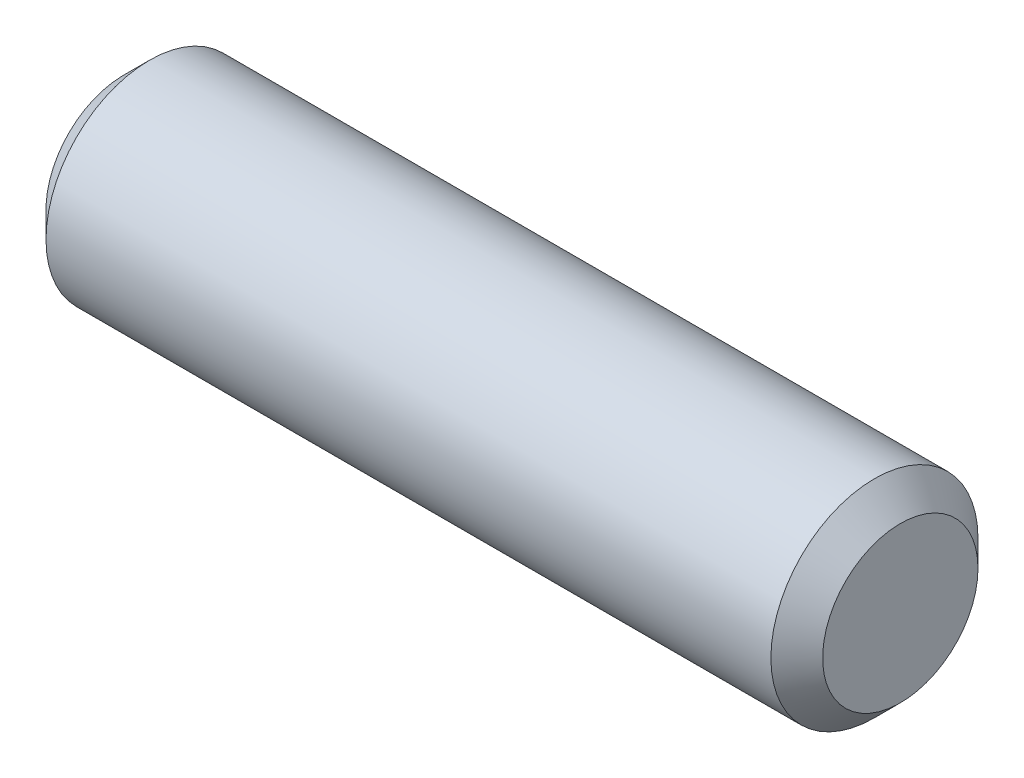
ISO-10303-21;
HEADER;
FILE_DESCRIPTION(('STEP AP214'),'2;1');
FILE_NAME('part.step','',(''),(''),'','','');
FILE_SCHEMA(('AUTOMOTIVE_DESIGN { 1 0 10303 214 1 1 1 1 }'));
ENDSEC;
DATA;
#1=APPLICATION_CONTEXT('core data for automotive mechanical design processes');
#2=APPLICATION_PROTOCOL_DEFINITION('international standard','automotive_design',2000,#1);
#3=PRODUCT_CONTEXT('',#1,'mechanical');
#4=PRODUCT('Part','Part','',(#3));
#5=PRODUCT_RELATED_PRODUCT_CATEGORY('part','',(#4));
#6=PRODUCT_DEFINITION_FORMATION('','',#4);
#7=PRODUCT_DEFINITION_CONTEXT('part definition',#1,'design');
#8=PRODUCT_DEFINITION('design','',#6,#7);
#9=PRODUCT_DEFINITION_SHAPE('','',#8);
#10=(LENGTH_UNIT() NAMED_UNIT(*) SI_UNIT(.MILLI.,.METRE.));
#11=(NAMED_UNIT(*) PLANE_ANGLE_UNIT() SI_UNIT($,.RADIAN.));
#12=(NAMED_UNIT(*) SI_UNIT($,.STERADIAN.) SOLID_ANGLE_UNIT());
#13=UNCERTAINTY_MEASURE_WITH_UNIT(LENGTH_MEASURE(1.E-05),#10,'distance_accuracy_value','');
#14=(GEOMETRIC_REPRESENTATION_CONTEXT(3) GLOBAL_UNCERTAINTY_ASSIGNED_CONTEXT((#13)) GLOBAL_UNIT_ASSIGNED_CONTEXT((#10,
#11,#12)) REPRESENTATION_CONTEXT('',''));
#15=CARTESIAN_POINT('',(0.,0.,0.));
#16=DIRECTION('',(0.,0.,1.));
#17=DIRECTION('',(1.,0.,0.));
#18=AXIS2_PLACEMENT_3D('',#15,#16,#17);
#19=CARTESIAN_POINT('',(15.,0.,0.));
#20=DIRECTION('',(-1.,0.,0.));
#21=DIRECTION('',(0.,0.,1.));
#22=AXIS2_PLACEMENT_3D('',#19,#20,#21);
#23=CYLINDRICAL_SURFACE('',#22,4.);
#24=CARTESIAN_POINT('',(-14.,0.,0.));
#25=DIRECTION('',(1.,0.,0.));
#26=DIRECTION('',(0.,0.,-1.));
#27=AXIS2_PLACEMENT_3D('',#24,#25,#26);
#28=CIRCLE('',#27,4.);
#29=CARTESIAN_POINT('',(-14.,0.,-4.));
#30=VERTEX_POINT('',#29);
#31=EDGE_CURVE('E47',#30,#30,#28,.T.);
#32=ORIENTED_EDGE('',*,*,#31,.T.);
#33=EDGE_LOOP('',(#32));
#34=FACE_BOUND('',#33,.T.);
#35=CARTESIAN_POINT('',(14.,0.,0.));
#36=DIRECTION('',(1.,0.,0.));
#37=DIRECTION('',(0.,0.,-1.));
#38=AXIS2_PLACEMENT_3D('',#35,#36,#37);
#39=CIRCLE('',#38,4.);
#40=CARTESIAN_POINT('',(14.,0.,-4.));
#41=VERTEX_POINT('',#40);
#42=EDGE_CURVE('E51',#41,#41,#39,.F.);
#43=ORIENTED_EDGE('',*,*,#42,.T.);
#44=EDGE_LOOP('',(#43));
#45=FACE_BOUND('',#44,.T.);
#46=ADVANCED_FACE('F35',(#34,#45),#23,.T.);
#47=CARTESIAN_POINT('',(15.,0.,0.));
#48=DIRECTION('',(1.,0.,0.));
#49=DIRECTION('',(0.,0.,-1.));
#50=AXIS2_PLACEMENT_3D('',#47,#48,#49);
#51=PLANE('',#50);
#52=CARTESIAN_POINT('',(15.,0.,0.));
#53=DIRECTION('',(1.,0.,0.));
#54=DIRECTION('',(0.,0.,-1.));
#55=AXIS2_PLACEMENT_3D('',#52,#53,#54);
#56=CIRCLE('',#55,3.);
#57=CARTESIAN_POINT('',(15.,0.,-3.));
#58=VERTEX_POINT('',#57);
#59=EDGE_CURVE('E10',#58,#58,#56,.T.);
#60=ORIENTED_EDGE('',*,*,#59,.T.);
#61=EDGE_LOOP('',(#60));
#62=FACE_BOUND('',#61,.T.);
#63=ADVANCED_FACE('F67',(#62),#51,.T.);
#64=CARTESIAN_POINT('',(-15.,0.,0.));
#65=DIRECTION('',(1.,0.,0.));
#66=DIRECTION('',(0.,0.,-1.));
#67=AXIS2_PLACEMENT_3D('',#64,#65,#66);
#68=PLANE('',#67);
#69=CARTESIAN_POINT('',(-15.,0.,0.));
#70=DIRECTION('',(1.,0.,0.));
#71=DIRECTION('',(0.,0.,-1.));
#72=AXIS2_PLACEMENT_3D('',#69,#70,#71);
#73=CIRCLE('',#72,2.99999999999999);
#74=CARTESIAN_POINT('',(-15.,0.,-2.99999999999999));
#75=VERTEX_POINT('',#74);
#76=EDGE_CURVE('E43',#75,#75,#73,.F.);
#77=ORIENTED_EDGE('',*,*,#76,.T.);
#78=EDGE_LOOP('',(#77));
#79=FACE_BOUND('',#78,.T.);
#80=ADVANCED_FACE('F64',(#79),#68,.F.);
#81=CARTESIAN_POINT('',(-14.,0.,0.));
#82=DIRECTION('',(1.,0.,0.));
#83=DIRECTION('',(0.,0.,-1.));
#84=AXIS2_PLACEMENT_3D('',#81,#82,#83);
#85=CONICAL_SURFACE('',#84,4.,0.78539816339745);
#86=ORIENTED_EDGE('',*,*,#76,.F.);
#87=EDGE_LOOP('',(#86));
#88=FACE_BOUND('',#87,.T.);
#89=ORIENTED_EDGE('',*,*,#31,.F.);
#90=EDGE_LOOP('',(#89));
#91=FACE_BOUND('',#90,.T.);
#92=ADVANCED_FACE('F60',(#88,#91),#85,.T.);
#93=CARTESIAN_POINT('',(15.,0.,0.));
#94=DIRECTION('',(-1.,0.,0.));
#95=DIRECTION('',(0.,0.,1.));
#96=AXIS2_PLACEMENT_3D('',#93,#94,#95);
#97=CONICAL_SURFACE('',#96,3.,0.785398163397447);
#98=ORIENTED_EDGE('',*,*,#42,.F.);
#99=EDGE_LOOP('',(#98));
#100=FACE_BOUND('',#99,.T.);
#101=ORIENTED_EDGE('',*,*,#59,.F.);
#102=EDGE_LOOP('',(#101));
#103=FACE_BOUND('',#102,.T.);
#104=ADVANCED_FACE('F38',(#100,#103),#97,.T.);
#105=CLOSED_SHELL('',(#46,#63,#80,#92,#104));
#106=MANIFOLD_SOLID_BREP('B2',#105);
#107=ADVANCED_BREP_SHAPE_REPRESENTATION('',(#18,#106),#14);
#108=SHAPE_DEFINITION_REPRESENTATION(#9,#107);
ENDSEC;
END-ISO-10303-21;
